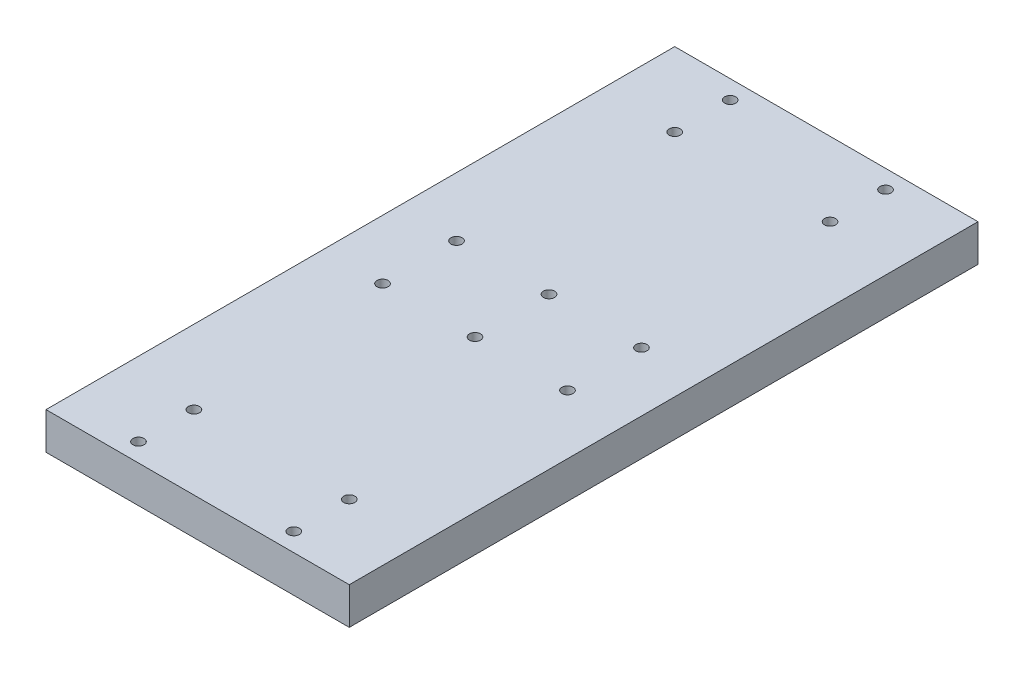
ISO-10303-21;
HEADER;
FILE_DESCRIPTION(('STEP AP214'),'2;1');
FILE_NAME('part.step','',(''),(''),'','','');
FILE_SCHEMA(('AUTOMOTIVE_DESIGN { 1 0 10303 214 1 1 1 1 }'));
ENDSEC;
DATA;
#1=APPLICATION_CONTEXT('core data for automotive mechanical design processes');
#2=APPLICATION_PROTOCOL_DEFINITION('international standard','automotive_design',2000,#1);
#3=PRODUCT_CONTEXT('',#1,'mechanical');
#4=PRODUCT('Part','Part','',(#3));
#5=PRODUCT_RELATED_PRODUCT_CATEGORY('part','',(#4));
#6=PRODUCT_DEFINITION_FORMATION('','',#4);
#7=PRODUCT_DEFINITION_CONTEXT('part definition',#1,'design');
#8=PRODUCT_DEFINITION('design','',#6,#7);
#9=PRODUCT_DEFINITION_SHAPE('','',#8);
#10=(LENGTH_UNIT() NAMED_UNIT(*) SI_UNIT(.MILLI.,.METRE.));
#11=(NAMED_UNIT(*) PLANE_ANGLE_UNIT() SI_UNIT($,.RADIAN.));
#12=(NAMED_UNIT(*) SI_UNIT($,.STERADIAN.) SOLID_ANGLE_UNIT());
#13=UNCERTAINTY_MEASURE_WITH_UNIT(LENGTH_MEASURE(1.E-05),#10,'distance_accuracy_value','');
#14=(GEOMETRIC_REPRESENTATION_CONTEXT(3) GLOBAL_UNCERTAINTY_ASSIGNED_CONTEXT((#13)) GLOBAL_UNIT_ASSIGNED_CONTEXT((#10,
#11,#12)) REPRESENTATION_CONTEXT('',''));
#15=CARTESIAN_POINT('',(0.,0.,0.));
#16=DIRECTION('',(0.,0.,1.));
#17=DIRECTION('',(1.,0.,0.));
#18=AXIS2_PLACEMENT_3D('',#15,#16,#17);
#19=CARTESIAN_POINT('',(41.,10.,-85.));
#20=DIRECTION('',(-1.,0.,0.));
#21=DIRECTION('',(0.,0.,1.));
#22=AXIS2_PLACEMENT_3D('',#19,#20,#21);
#23=PLANE('',#22);
#24=DIRECTION('',(0.,0.,-1.));
#25=VECTOR('',#24,1.);
#26=CARTESIAN_POINT('',(41.,0.,-85.));
#27=LINE('',#26,#25);
#28=CARTESIAN_POINT('',(41.,0.,85.));
#29=VERTEX_POINT('',#28);
#30=CARTESIAN_POINT('',(41.,0.,-85.));
#31=VERTEX_POINT('',#30);
#32=EDGE_CURVE('E102',#29,#31,#27,.T.);
#33=ORIENTED_EDGE('',*,*,#32,.T.);
#34=DIRECTION('',(0.,-1.,0.));
#35=VECTOR('',#34,1.);
#36=CARTESIAN_POINT('',(41.,10.,-85.));
#37=LINE('',#36,#35);
#38=CARTESIAN_POINT('',(41.,10.,-85.));
#39=VERTEX_POINT('',#38);
#40=EDGE_CURVE('E11',#39,#31,#37,.T.);
#41=ORIENTED_EDGE('',*,*,#40,.F.);
#42=DIRECTION('',(0.,0.,-1.));
#43=VECTOR('',#42,1.);
#44=CARTESIAN_POINT('',(41.,10.,-85.));
#45=LINE('',#44,#43);
#46=CARTESIAN_POINT('',(41.,10.,85.));
#47=VERTEX_POINT('',#46);
#48=EDGE_CURVE('E90',#47,#39,#45,.T.);
#49=ORIENTED_EDGE('',*,*,#48,.F.);
#50=DIRECTION('',(0.,-1.,0.));
#51=VECTOR('',#50,1.);
#52=CARTESIAN_POINT('',(41.,10.,85.));
#53=LINE('',#52,#51);
#54=EDGE_CURVE('E98',#47,#29,#53,.T.);
#55=ORIENTED_EDGE('',*,*,#54,.T.);
#56=EDGE_LOOP('',(#33,#41,#49,#55));
#57=FACE_BOUND('',#56,.T.);
#58=ADVANCED_FACE('F39',(#57),#23,.F.);
#59=CARTESIAN_POINT('',(-41.,10.,-85.));
#60=DIRECTION('',(0.,0.,1.));
#61=DIRECTION('',(1.,0.,0.));
#62=AXIS2_PLACEMENT_3D('',#59,#60,#61);
#63=PLANE('',#62);
#64=DIRECTION('',(-1.,0.,0.));
#65=VECTOR('',#64,1.);
#66=CARTESIAN_POINT('',(-41.,0.,-85.));
#67=LINE('',#66,#65);
#68=CARTESIAN_POINT('',(-41.,0.,-85.));
#69=VERTEX_POINT('',#68);
#70=EDGE_CURVE('E94',#31,#69,#67,.T.);
#71=ORIENTED_EDGE('',*,*,#70,.T.);
#72=DIRECTION('',(0.,-1.,0.));
#73=VECTOR('',#72,1.);
#74=CARTESIAN_POINT('',(-41.,10.,-85.));
#75=LINE('',#74,#73);
#76=CARTESIAN_POINT('',(-41.,10.,-85.));
#77=VERTEX_POINT('',#76);
#78=EDGE_CURVE('E47',#77,#69,#75,.T.);
#79=ORIENTED_EDGE('',*,*,#78,.F.);
#80=DIRECTION('',(-1.,0.,0.));
#81=VECTOR('',#80,1.);
#82=CARTESIAN_POINT('',(-41.,10.,-85.));
#83=LINE('',#82,#81);
#84=EDGE_CURVE('E85',#39,#77,#83,.T.);
#85=ORIENTED_EDGE('',*,*,#84,.F.);
#86=ORIENTED_EDGE('',*,*,#40,.T.);
#87=EDGE_LOOP('',(#71,#79,#85,#86));
#88=FACE_BOUND('',#87,.T.);
#89=ADVANCED_FACE('F93',(#88),#63,.F.);
#90=CARTESIAN_POINT('',(-41.,10.,-85.));
#91=DIRECTION('',(1.,0.,0.));
#92=DIRECTION('',(0.,0.,-1.));
#93=AXIS2_PLACEMENT_3D('',#90,#91,#92);
#94=PLANE('',#93);
#95=DIRECTION('',(0.,0.,1.));
#96=VECTOR('',#95,1.);
#97=CARTESIAN_POINT('',(-41.,0.,-85.));
#98=LINE('',#97,#96);
#99=CARTESIAN_POINT('',(-41.,0.,85.));
#100=VERTEX_POINT('',#99);
#101=EDGE_CURVE('E72',#69,#100,#98,.T.);
#102=ORIENTED_EDGE('',*,*,#101,.T.);
#103=DIRECTION('',(0.,-1.,0.));
#104=VECTOR('',#103,1.);
#105=CARTESIAN_POINT('',(-41.,10.,85.));
#106=LINE('',#105,#104);
#107=CARTESIAN_POINT('',(-41.,10.,85.));
#108=VERTEX_POINT('',#107);
#109=EDGE_CURVE('E95',#108,#100,#106,.T.);
#110=ORIENTED_EDGE('',*,*,#109,.F.);
#111=DIRECTION('',(0.,0.,1.));
#112=VECTOR('',#111,1.);
#113=CARTESIAN_POINT('',(-41.,10.,-85.));
#114=LINE('',#113,#112);
#115=EDGE_CURVE('E88',#77,#108,#114,.T.);
#116=ORIENTED_EDGE('',*,*,#115,.F.);
#117=ORIENTED_EDGE('',*,*,#78,.T.);
#118=EDGE_LOOP('',(#102,#110,#116,#117));
#119=FACE_BOUND('',#118,.T.);
#120=ADVANCED_FACE('F96',(#119),#94,.F.);
#121=CARTESIAN_POINT('',(-41.,10.,85.));
#122=DIRECTION('',(0.,0.,-1.));
#123=DIRECTION('',(-1.,0.,0.));
#124=AXIS2_PLACEMENT_3D('',#121,#122,#123);
#125=PLANE('',#124);
#126=DIRECTION('',(1.,0.,0.));
#127=VECTOR('',#126,1.);
#128=CARTESIAN_POINT('',(-41.,0.,85.));
#129=LINE('',#128,#127);
#130=EDGE_CURVE('E78',#100,#29,#129,.T.);
#131=ORIENTED_EDGE('',*,*,#130,.T.);
#132=ORIENTED_EDGE('',*,*,#54,.F.);
#133=DIRECTION('',(1.,0.,0.));
#134=VECTOR('',#133,1.);
#135=CARTESIAN_POINT('',(-41.,10.,85.));
#136=LINE('',#135,#134);
#137=EDGE_CURVE('E55',#108,#47,#136,.T.);
#138=ORIENTED_EDGE('',*,*,#137,.F.);
#139=ORIENTED_EDGE('',*,*,#109,.T.);
#140=EDGE_LOOP('',(#131,#132,#138,#139));
#141=FACE_BOUND('',#140,.T.);
#142=ADVANCED_FACE('F110',(#141),#125,.F.);
#143=CARTESIAN_POINT('',(0.,10.,0.));
#144=DIRECTION('',(0.,1.,0.));
#145=DIRECTION('',(0.,0.,1.));
#146=AXIS2_PLACEMENT_3D('',#143,#144,#145);
#147=PLANE('',#146);
#148=CARTESIAN_POINT('',(21.,10.,80.));
#149=DIRECTION('',(0.,1.,0.));
#150=DIRECTION('',(0.,0.,-1.));
#151=AXIS2_PLACEMENT_3D('',#148,#149,#150);
#152=CIRCLE('',#151,1.5);
#153=CARTESIAN_POINT('',(21.,10.,78.5));
#154=VERTEX_POINT('',#153);
#155=EDGE_CURVE('E180',#154,#154,#152,.T.);
#156=ORIENTED_EDGE('',*,*,#155,.F.);
#157=EDGE_LOOP('',(#156));
#158=FACE_BOUND('',#157,.T.);
#159=CARTESIAN_POINT('',(21.,10.,65.));
#160=DIRECTION('',(0.,1.,0.));
#161=DIRECTION('',(0.,0.,-1.));
#162=AXIS2_PLACEMENT_3D('',#159,#160,#161);
#163=CIRCLE('',#162,1.5);
#164=CARTESIAN_POINT('',(21.,10.,63.5));
#165=VERTEX_POINT('',#164);
#166=EDGE_CURVE('E191',#165,#165,#163,.T.);
#167=ORIENTED_EDGE('',*,*,#166,.F.);
#168=EDGE_LOOP('',(#167));
#169=FACE_BOUND('',#168,.T.);
#170=CARTESIAN_POINT('',(21.,10.,-80.));
#171=DIRECTION('',(0.,-1.,0.));
#172=DIRECTION('',(0.,0.,1.));
#173=AXIS2_PLACEMENT_3D('',#170,#171,#172);
#174=CIRCLE('',#173,1.5);
#175=CARTESIAN_POINT('',(21.,10.,-78.5));
#176=VERTEX_POINT('',#175);
#177=EDGE_CURVE('E168',#176,#176,#174,.T.);
#178=ORIENTED_EDGE('',*,*,#177,.T.);
#179=EDGE_LOOP('',(#178));
#180=FACE_BOUND('',#179,.T.);
#181=CARTESIAN_POINT('',(21.,10.,-65.));
#182=DIRECTION('',(0.,-1.,0.));
#183=DIRECTION('',(0.,0.,1.));
#184=AXIS2_PLACEMENT_3D('',#181,#182,#183);
#185=CIRCLE('',#184,1.5);
#186=CARTESIAN_POINT('',(21.,10.,-63.5));
#187=VERTEX_POINT('',#186);
#188=EDGE_CURVE('E179',#187,#187,#185,.T.);
#189=ORIENTED_EDGE('',*,*,#188,.T.);
#190=EDGE_LOOP('',(#189));
#191=FACE_BOUND('',#190,.T.);
#192=CARTESIAN_POINT('',(-21.,10.,-80.));
#193=DIRECTION('',(0.,1.,0.));
#194=DIRECTION('',(0.,0.,1.));
#195=AXIS2_PLACEMENT_3D('',#192,#193,#194);
#196=CIRCLE('',#195,1.5);
#197=CARTESIAN_POINT('',(-21.,10.,-78.5));
#198=VERTEX_POINT('',#197);
#199=EDGE_CURVE('E156',#198,#198,#196,.T.);
#200=ORIENTED_EDGE('',*,*,#199,.F.);
#201=EDGE_LOOP('',(#200));
#202=FACE_BOUND('',#201,.T.);
#203=CARTESIAN_POINT('',(-21.,10.,-65.));
#204=DIRECTION('',(0.,1.,0.));
#205=DIRECTION('',(0.,0.,1.));
#206=AXIS2_PLACEMENT_3D('',#203,#204,#205);
#207=CIRCLE('',#206,1.5);
#208=CARTESIAN_POINT('',(-21.,10.,-63.5));
#209=VERTEX_POINT('',#208);
#210=EDGE_CURVE('E167',#209,#209,#207,.T.);
#211=ORIENTED_EDGE('',*,*,#210,.F.);
#212=EDGE_LOOP('',(#211));
#213=FACE_BOUND('',#212,.T.);
#214=CARTESIAN_POINT('',(-21.,10.,80.));
#215=DIRECTION('',(0.,-1.,0.));
#216=DIRECTION('',(0.,0.,-1.));
#217=AXIS2_PLACEMENT_3D('',#214,#215,#216);
#218=CIRCLE('',#217,1.5);
#219=CARTESIAN_POINT('',(-21.,10.,78.5));
#220=VERTEX_POINT('',#219);
#221=EDGE_CURVE('E149',#220,#220,#218,.T.);
#222=ORIENTED_EDGE('',*,*,#221,.T.);
#223=EDGE_LOOP('',(#222));
#224=FACE_BOUND('',#223,.T.);
#225=CARTESIAN_POINT('',(-21.,10.,65.));
#226=DIRECTION('',(0.,-1.,0.));
#227=DIRECTION('',(0.,0.,-1.));
#228=AXIS2_PLACEMENT_3D('',#225,#226,#227);
#229=CIRCLE('',#228,1.5);
#230=CARTESIAN_POINT('',(-21.,10.,63.5));
#231=VERTEX_POINT('',#230);
#232=EDGE_CURVE('E155',#231,#231,#229,.T.);
#233=ORIENTED_EDGE('',*,*,#232,.T.);
#234=EDGE_LOOP('',(#233));
#235=FACE_BOUND('',#234,.T.);
#236=CARTESIAN_POINT('',(0.,10.,-10.));
#237=DIRECTION('',(0.,1.,0.));
#238=DIRECTION('',(0.,0.,1.));
#239=AXIS2_PLACEMENT_3D('',#236,#237,#238);
#240=CIRCLE('',#239,1.5);
#241=CARTESIAN_POINT('',(0.,10.,-8.50000000000001));
#242=VERTEX_POINT('',#241);
#243=EDGE_CURVE('E141',#242,#242,#240,.T.);
#244=ORIENTED_EDGE('',*,*,#243,.F.);
#245=EDGE_LOOP('',(#244));
#246=FACE_BOUND('',#245,.T.);
#247=CARTESIAN_POINT('',(25.,10.,-10.));
#248=DIRECTION('',(0.,1.,0.));
#249=DIRECTION('',(0.,0.,1.));
#250=AXIS2_PLACEMENT_3D('',#247,#248,#249);
#251=CIRCLE('',#250,1.5);
#252=CARTESIAN_POINT('',(25.,10.,-8.50000000000001));
#253=VERTEX_POINT('',#252);
#254=EDGE_CURVE('E135',#253,#253,#251,.T.);
#255=ORIENTED_EDGE('',*,*,#254,.F.);
#256=EDGE_LOOP('',(#255));
#257=FACE_BOUND('',#256,.T.);
#258=CARTESIAN_POINT('',(-25.,10.,9.99999999999999));
#259=DIRECTION('',(0.,1.,0.));
#260=DIRECTION('',(0.,0.,1.));
#261=AXIS2_PLACEMENT_3D('',#258,#259,#260);
#262=CIRCLE('',#261,1.5);
#263=CARTESIAN_POINT('',(-25.,10.,11.5));
#264=VERTEX_POINT('',#263);
#265=EDGE_CURVE('E129',#264,#264,#262,.T.);
#266=ORIENTED_EDGE('',*,*,#265,.F.);
#267=EDGE_LOOP('',(#266));
#268=FACE_BOUND('',#267,.T.);
#269=CARTESIAN_POINT('',(0.,10.,9.99999999999999));
#270=DIRECTION('',(0.,1.,0.));
#271=DIRECTION('',(0.,0.,1.));
#272=AXIS2_PLACEMENT_3D('',#269,#270,#271);
#273=CIRCLE('',#272,1.5);
#274=CARTESIAN_POINT('',(0.,10.,11.5));
#275=VERTEX_POINT('',#274);
#276=EDGE_CURVE('E122',#275,#275,#273,.T.);
#277=ORIENTED_EDGE('',*,*,#276,.F.);
#278=EDGE_LOOP('',(#277));
#279=FACE_BOUND('',#278,.T.);
#280=CARTESIAN_POINT('',(25.,10.,9.99999999999999));
#281=DIRECTION('',(0.,1.,0.));
#282=DIRECTION('',(0.,0.,1.));
#283=AXIS2_PLACEMENT_3D('',#280,#281,#282);
#284=CIRCLE('',#283,1.5);
#285=CARTESIAN_POINT('',(25.,10.,11.5));
#286=VERTEX_POINT('',#285);
#287=EDGE_CURVE('E146',#286,#286,#284,.T.);
#288=ORIENTED_EDGE('',*,*,#287,.F.);
#289=EDGE_LOOP('',(#288));
#290=FACE_BOUND('',#289,.T.);
#291=CARTESIAN_POINT('',(-25.,10.,-10.));
#292=DIRECTION('',(0.,1.,0.));
#293=DIRECTION('',(0.,0.,1.));
#294=AXIS2_PLACEMENT_3D('',#291,#292,#293);
#295=CIRCLE('',#294,1.5);
#296=CARTESIAN_POINT('',(-25.,10.,-8.50000000000001));
#297=VERTEX_POINT('',#296);
#298=EDGE_CURVE('E116',#297,#297,#295,.T.);
#299=ORIENTED_EDGE('',*,*,#298,.F.);
#300=EDGE_LOOP('',(#299));
#301=FACE_BOUND('',#300,.T.);
#302=ORIENTED_EDGE('',*,*,#48,.T.);
#303=ORIENTED_EDGE('',*,*,#84,.T.);
#304=ORIENTED_EDGE('',*,*,#115,.T.);
#305=ORIENTED_EDGE('',*,*,#137,.T.);
#306=EDGE_LOOP('',(#302,#303,#304,#305));
#307=FACE_BOUND('',#306,.T.);
#308=ADVANCED_FACE('F86',(#158,#169,#180,#191,#202,#213,#224,#235,#246,#257,#268,#279,#290,#301,
#307),#147,.T.);
#309=CARTESIAN_POINT('',(0.,0.,0.));
#310=DIRECTION('',(0.,1.,0.));
#311=DIRECTION('',(0.,0.,1.));
#312=AXIS2_PLACEMENT_3D('',#309,#310,#311);
#313=PLANE('',#312);
#314=CARTESIAN_POINT('',(21.,0.,80.));
#315=DIRECTION('',(0.,1.,0.));
#316=DIRECTION('',(0.,0.,-1.));
#317=AXIS2_PLACEMENT_3D('',#314,#315,#316);
#318=CIRCLE('',#317,1.5);
#319=CARTESIAN_POINT('',(21.,0.,78.5));
#320=VERTEX_POINT('',#319);
#321=EDGE_CURVE('E194',#320,#320,#318,.T.);
#322=ORIENTED_EDGE('',*,*,#321,.T.);
#323=EDGE_LOOP('',(#322));
#324=FACE_BOUND('',#323,.T.);
#325=CARTESIAN_POINT('',(21.,0.,65.));
#326=DIRECTION('',(0.,1.,0.));
#327=DIRECTION('',(0.,0.,-1.));
#328=AXIS2_PLACEMENT_3D('',#325,#326,#327);
#329=CIRCLE('',#328,1.5);
#330=CARTESIAN_POINT('',(21.,0.,63.5));
#331=VERTEX_POINT('',#330);
#332=EDGE_CURVE('E188',#331,#331,#329,.T.);
#333=ORIENTED_EDGE('',*,*,#332,.T.);
#334=EDGE_LOOP('',(#333));
#335=FACE_BOUND('',#334,.T.);
#336=CARTESIAN_POINT('',(21.,0.,-80.));
#337=DIRECTION('',(0.,-1.,0.));
#338=DIRECTION('',(0.,0.,1.));
#339=AXIS2_PLACEMENT_3D('',#336,#337,#338);
#340=CIRCLE('',#339,1.5);
#341=CARTESIAN_POINT('',(21.,0.,-78.5));
#342=VERTEX_POINT('',#341);
#343=EDGE_CURVE('E183',#342,#342,#340,.T.);
#344=ORIENTED_EDGE('',*,*,#343,.F.);
#345=EDGE_LOOP('',(#344));
#346=FACE_BOUND('',#345,.T.);
#347=CARTESIAN_POINT('',(21.,0.,-65.));
#348=DIRECTION('',(0.,-1.,0.));
#349=DIRECTION('',(0.,0.,1.));
#350=AXIS2_PLACEMENT_3D('',#347,#348,#349);
#351=CIRCLE('',#350,1.5);
#352=CARTESIAN_POINT('',(21.,0.,-63.5));
#353=VERTEX_POINT('',#352);
#354=EDGE_CURVE('E176',#353,#353,#351,.T.);
#355=ORIENTED_EDGE('',*,*,#354,.F.);
#356=EDGE_LOOP('',(#355));
#357=FACE_BOUND('',#356,.T.);
#358=CARTESIAN_POINT('',(-21.,0.,-80.));
#359=DIRECTION('',(0.,1.,0.));
#360=DIRECTION('',(0.,0.,1.));
#361=AXIS2_PLACEMENT_3D('',#358,#359,#360);
#362=CIRCLE('',#361,1.5);
#363=CARTESIAN_POINT('',(-21.,0.,-78.5));
#364=VERTEX_POINT('',#363);
#365=EDGE_CURVE('E171',#364,#364,#362,.T.);
#366=ORIENTED_EDGE('',*,*,#365,.T.);
#367=EDGE_LOOP('',(#366));
#368=FACE_BOUND('',#367,.T.);
#369=CARTESIAN_POINT('',(-21.,0.,-65.));
#370=DIRECTION('',(0.,1.,0.));
#371=DIRECTION('',(0.,0.,1.));
#372=AXIS2_PLACEMENT_3D('',#369,#370,#371);
#373=CIRCLE('',#372,1.5);
#374=CARTESIAN_POINT('',(-21.,0.,-63.5));
#375=VERTEX_POINT('',#374);
#376=EDGE_CURVE('E164',#375,#375,#373,.T.);
#377=ORIENTED_EDGE('',*,*,#376,.T.);
#378=EDGE_LOOP('',(#377));
#379=FACE_BOUND('',#378,.T.);
#380=CARTESIAN_POINT('',(-21.,0.,80.));
#381=DIRECTION('',(0.,-1.,0.));
#382=DIRECTION('',(0.,0.,-1.));
#383=AXIS2_PLACEMENT_3D('',#380,#381,#382);
#384=CIRCLE('',#383,1.5);
#385=CARTESIAN_POINT('',(-21.,0.,78.5));
#386=VERTEX_POINT('',#385);
#387=EDGE_CURVE('E159',#386,#386,#384,.T.);
#388=ORIENTED_EDGE('',*,*,#387,.F.);
#389=EDGE_LOOP('',(#388));
#390=FACE_BOUND('',#389,.T.);
#391=CARTESIAN_POINT('',(-21.,0.,65.));
#392=DIRECTION('',(0.,-1.,0.));
#393=DIRECTION('',(0.,0.,-1.));
#394=AXIS2_PLACEMENT_3D('',#391,#392,#393);
#395=CIRCLE('',#394,1.5);
#396=CARTESIAN_POINT('',(-21.,0.,63.5));
#397=VERTEX_POINT('',#396);
#398=EDGE_CURVE('E152',#397,#397,#395,.T.);
#399=ORIENTED_EDGE('',*,*,#398,.F.);
#400=EDGE_LOOP('',(#399));
#401=FACE_BOUND('',#400,.T.);
#402=CARTESIAN_POINT('',(0.,0.,-10.));
#403=DIRECTION('',(0.,1.,0.));
#404=DIRECTION('',(0.,0.,1.));
#405=AXIS2_PLACEMENT_3D('',#402,#403,#404);
#406=CIRCLE('',#405,1.5);
#407=CARTESIAN_POINT('',(0.,0.,-8.50000000000001));
#408=VERTEX_POINT('',#407);
#409=EDGE_CURVE('E119',#408,#408,#406,.T.);
#410=ORIENTED_EDGE('',*,*,#409,.T.);
#411=EDGE_LOOP('',(#410));
#412=FACE_BOUND('',#411,.T.);
#413=CARTESIAN_POINT('',(25.,0.,-10.));
#414=DIRECTION('',(0.,1.,0.));
#415=DIRECTION('',(0.,0.,1.));
#416=AXIS2_PLACEMENT_3D('',#413,#414,#415);
#417=CIRCLE('',#416,1.5);
#418=CARTESIAN_POINT('',(25.,0.,-8.50000000000001));
#419=VERTEX_POINT('',#418);
#420=EDGE_CURVE('E138',#419,#419,#417,.T.);
#421=ORIENTED_EDGE('',*,*,#420,.T.);
#422=EDGE_LOOP('',(#421));
#423=FACE_BOUND('',#422,.T.);
#424=CARTESIAN_POINT('',(-25.,0.,9.99999999999999));
#425=DIRECTION('',(0.,1.,0.));
#426=DIRECTION('',(0.,0.,1.));
#427=AXIS2_PLACEMENT_3D('',#424,#425,#426);
#428=CIRCLE('',#427,1.5);
#429=CARTESIAN_POINT('',(-25.,0.,11.5));
#430=VERTEX_POINT('',#429);
#431=EDGE_CURVE('E132',#430,#430,#428,.T.);
#432=ORIENTED_EDGE('',*,*,#431,.T.);
#433=EDGE_LOOP('',(#432));
#434=FACE_BOUND('',#433,.T.);
#435=CARTESIAN_POINT('',(0.,0.,9.99999999999999));
#436=DIRECTION('',(0.,1.,0.));
#437=DIRECTION('',(0.,0.,1.));
#438=AXIS2_PLACEMENT_3D('',#435,#436,#437);
#439=CIRCLE('',#438,1.5);
#440=CARTESIAN_POINT('',(0.,0.,11.5));
#441=VERTEX_POINT('',#440);
#442=EDGE_CURVE('E125',#441,#441,#439,.T.);
#443=ORIENTED_EDGE('',*,*,#442,.T.);
#444=EDGE_LOOP('',(#443));
#445=FACE_BOUND('',#444,.T.);
#446=CARTESIAN_POINT('',(25.,0.,9.99999999999999));
#447=DIRECTION('',(0.,1.,0.));
#448=DIRECTION('',(0.,0.,1.));
#449=AXIS2_PLACEMENT_3D('',#446,#447,#448);
#450=CIRCLE('',#449,1.5);
#451=CARTESIAN_POINT('',(25.,0.,11.5));
#452=VERTEX_POINT('',#451);
#453=EDGE_CURVE('E126',#452,#452,#450,.T.);
#454=ORIENTED_EDGE('',*,*,#453,.T.);
#455=EDGE_LOOP('',(#454));
#456=FACE_BOUND('',#455,.T.);
#457=CARTESIAN_POINT('',(-25.,0.,-10.));
#458=DIRECTION('',(0.,1.,0.));
#459=DIRECTION('',(0.,0.,1.));
#460=AXIS2_PLACEMENT_3D('',#457,#458,#459);
#461=CIRCLE('',#460,1.5);
#462=CARTESIAN_POINT('',(-25.,0.,-8.50000000000001));
#463=VERTEX_POINT('',#462);
#464=EDGE_CURVE('E105',#463,#463,#461,.T.);
#465=ORIENTED_EDGE('',*,*,#464,.T.);
#466=EDGE_LOOP('',(#465));
#467=FACE_BOUND('',#466,.T.);
#468=ORIENTED_EDGE('',*,*,#32,.F.);
#469=ORIENTED_EDGE('',*,*,#130,.F.);
#470=ORIENTED_EDGE('',*,*,#101,.F.);
#471=ORIENTED_EDGE('',*,*,#70,.F.);
#472=EDGE_LOOP('',(#468,#469,#470,#471));
#473=FACE_BOUND('',#472,.T.);
#474=ADVANCED_FACE('F113',(#324,#335,#346,#357,#368,#379,#390,#401,#412,#423,#434,#445,#456,
#467,#473),#313,.F.);
#475=CARTESIAN_POINT('',(-25.,0.,-10.));
#476=DIRECTION('',(0.,1.,0.));
#477=DIRECTION('',(0.,0.,1.));
#478=AXIS2_PLACEMENT_3D('',#475,#476,#477);
#479=CYLINDRICAL_SURFACE('',#478,1.5);
#480=ORIENTED_EDGE('',*,*,#464,.F.);
#481=EDGE_LOOP('',(#480));
#482=FACE_BOUND('',#481,.T.);
#483=ORIENTED_EDGE('',*,*,#298,.T.);
#484=EDGE_LOOP('',(#483));
#485=FACE_BOUND('',#484,.T.);
#486=ADVANCED_FACE('F232',(#482,#485),#479,.F.);
#487=CARTESIAN_POINT('',(25.,0.,9.99999999999999));
#488=DIRECTION('',(0.,1.,0.));
#489=DIRECTION('',(0.,0.,1.));
#490=AXIS2_PLACEMENT_3D('',#487,#488,#489);
#491=CYLINDRICAL_SURFACE('',#490,1.5);
#492=ORIENTED_EDGE('',*,*,#453,.F.);
#493=EDGE_LOOP('',(#492));
#494=FACE_BOUND('',#493,.T.);
#495=ORIENTED_EDGE('',*,*,#287,.T.);
#496=EDGE_LOOP('',(#495));
#497=FACE_BOUND('',#496,.T.);
#498=ADVANCED_FACE('F234',(#494,#497),#491,.F.);
#499=CARTESIAN_POINT('',(0.,0.,9.99999999999999));
#500=DIRECTION('',(0.,1.,0.));
#501=DIRECTION('',(0.,0.,1.));
#502=AXIS2_PLACEMENT_3D('',#499,#500,#501);
#503=CYLINDRICAL_SURFACE('',#502,1.5);
#504=ORIENTED_EDGE('',*,*,#442,.F.);
#505=EDGE_LOOP('',(#504));
#506=FACE_BOUND('',#505,.T.);
#507=ORIENTED_EDGE('',*,*,#276,.T.);
#508=EDGE_LOOP('',(#507));
#509=FACE_BOUND('',#508,.T.);
#510=ADVANCED_FACE('F241',(#506,#509),#503,.F.);
#511=CARTESIAN_POINT('',(-25.,0.,9.99999999999999));
#512=DIRECTION('',(0.,1.,0.));
#513=DIRECTION('',(0.,0.,1.));
#514=AXIS2_PLACEMENT_3D('',#511,#512,#513);
#515=CYLINDRICAL_SURFACE('',#514,1.5);
#516=ORIENTED_EDGE('',*,*,#431,.F.);
#517=EDGE_LOOP('',(#516));
#518=FACE_BOUND('',#517,.T.);
#519=ORIENTED_EDGE('',*,*,#265,.T.);
#520=EDGE_LOOP('',(#519));
#521=FACE_BOUND('',#520,.T.);
#522=ADVANCED_FACE('F341',(#518,#521),#515,.F.);
#523=CARTESIAN_POINT('',(25.,0.,-10.));
#524=DIRECTION('',(0.,1.,0.));
#525=DIRECTION('',(0.,0.,1.));
#526=AXIS2_PLACEMENT_3D('',#523,#524,#525);
#527=CYLINDRICAL_SURFACE('',#526,1.5);
#528=ORIENTED_EDGE('',*,*,#420,.F.);
#529=EDGE_LOOP('',(#528));
#530=FACE_BOUND('',#529,.T.);
#531=ORIENTED_EDGE('',*,*,#254,.T.);
#532=EDGE_LOOP('',(#531));
#533=FACE_BOUND('',#532,.T.);
#534=ADVANCED_FACE('F337',(#530,#533),#527,.F.);
#535=CARTESIAN_POINT('',(0.,0.,-10.));
#536=DIRECTION('',(0.,1.,0.));
#537=DIRECTION('',(0.,0.,1.));
#538=AXIS2_PLACEMENT_3D('',#535,#536,#537);
#539=CYLINDRICAL_SURFACE('',#538,1.5);
#540=ORIENTED_EDGE('',*,*,#409,.F.);
#541=EDGE_LOOP('',(#540));
#542=FACE_BOUND('',#541,.T.);
#543=ORIENTED_EDGE('',*,*,#243,.T.);
#544=EDGE_LOOP('',(#543));
#545=FACE_BOUND('',#544,.T.);
#546=ADVANCED_FACE('F332',(#542,#545),#539,.F.);
#547=CARTESIAN_POINT('',(-21.,10.,65.));
#548=DIRECTION('',(0.,-1.,0.));
#549=DIRECTION('',(0.,0.,-1.));
#550=AXIS2_PLACEMENT_3D('',#547,#548,#549);
#551=CYLINDRICAL_SURFACE('',#550,1.5);
#552=ORIENTED_EDGE('',*,*,#232,.F.);
#553=EDGE_LOOP('',(#552));
#554=FACE_BOUND('',#553,.T.);
#555=ORIENTED_EDGE('',*,*,#398,.T.);
#556=EDGE_LOOP('',(#555));
#557=FACE_BOUND('',#556,.T.);
#558=ADVANCED_FACE('F329',(#554,#557),#551,.F.);
#559=CARTESIAN_POINT('',(-21.,10.,80.));
#560=DIRECTION('',(0.,-1.,0.));
#561=DIRECTION('',(0.,0.,-1.));
#562=AXIS2_PLACEMENT_3D('',#559,#560,#561);
#563=CYLINDRICAL_SURFACE('',#562,1.5);
#564=ORIENTED_EDGE('',*,*,#221,.F.);
#565=EDGE_LOOP('',(#564));
#566=FACE_BOUND('',#565,.T.);
#567=ORIENTED_EDGE('',*,*,#387,.T.);
#568=EDGE_LOOP('',(#567));
#569=FACE_BOUND('',#568,.T.);
#570=ADVANCED_FACE('F325',(#566,#569),#563,.F.);
#571=CARTESIAN_POINT('',(-21.,10.,-65.));
#572=DIRECTION('',(0.,-1.,0.));
#573=DIRECTION('',(0.,0.,-1.));
#574=AXIS2_PLACEMENT_3D('',#571,#572,#573);
#575=CYLINDRICAL_SURFACE('',#574,1.5);
#576=ORIENTED_EDGE('',*,*,#210,.T.);
#577=EDGE_LOOP('',(#576));
#578=FACE_BOUND('',#577,.T.);
#579=ORIENTED_EDGE('',*,*,#376,.F.);
#580=EDGE_LOOP('',(#579));
#581=FACE_BOUND('',#580,.T.);
#582=ADVANCED_FACE('F321',(#578,#581),#575,.F.);
#583=CARTESIAN_POINT('',(-21.,10.,-80.));
#584=DIRECTION('',(0.,-1.,0.));
#585=DIRECTION('',(0.,0.,-1.));
#586=AXIS2_PLACEMENT_3D('',#583,#584,#585);
#587=CYLINDRICAL_SURFACE('',#586,1.5);
#588=ORIENTED_EDGE('',*,*,#199,.T.);
#589=EDGE_LOOP('',(#588));
#590=FACE_BOUND('',#589,.T.);
#591=ORIENTED_EDGE('',*,*,#365,.F.);
#592=EDGE_LOOP('',(#591));
#593=FACE_BOUND('',#592,.T.);
#594=ADVANCED_FACE('F285',(#590,#593),#587,.F.);
#595=CARTESIAN_POINT('',(21.,10.,-65.));
#596=DIRECTION('',(0.,-1.,0.));
#597=DIRECTION('',(0.,0.,-1.));
#598=AXIS2_PLACEMENT_3D('',#595,#596,#597);
#599=CYLINDRICAL_SURFACE('',#598,1.5);
#600=ORIENTED_EDGE('',*,*,#188,.F.);
#601=EDGE_LOOP('',(#600));
#602=FACE_BOUND('',#601,.T.);
#603=ORIENTED_EDGE('',*,*,#354,.T.);
#604=EDGE_LOOP('',(#603));
#605=FACE_BOUND('',#604,.T.);
#606=ADVANCED_FACE('F279',(#602,#605),#599,.F.);
#607=CARTESIAN_POINT('',(21.,10.,-80.));
#608=DIRECTION('',(0.,-1.,0.));
#609=DIRECTION('',(0.,0.,-1.));
#610=AXIS2_PLACEMENT_3D('',#607,#608,#609);
#611=CYLINDRICAL_SURFACE('',#610,1.5);
#612=ORIENTED_EDGE('',*,*,#177,.F.);
#613=EDGE_LOOP('',(#612));
#614=FACE_BOUND('',#613,.T.);
#615=ORIENTED_EDGE('',*,*,#343,.T.);
#616=EDGE_LOOP('',(#615));
#617=FACE_BOUND('',#616,.T.);
#618=ADVANCED_FACE('F284',(#614,#617),#611,.F.);
#619=CARTESIAN_POINT('',(21.,10.,65.));
#620=DIRECTION('',(0.,-1.,0.));
#621=DIRECTION('',(0.,0.,-1.));
#622=AXIS2_PLACEMENT_3D('',#619,#620,#621);
#623=CYLINDRICAL_SURFACE('',#622,1.5);
#624=ORIENTED_EDGE('',*,*,#166,.T.);
#625=EDGE_LOOP('',(#624));
#626=FACE_BOUND('',#625,.T.);
#627=ORIENTED_EDGE('',*,*,#332,.F.);
#628=EDGE_LOOP('',(#627));
#629=FACE_BOUND('',#628,.T.);
#630=ADVANCED_FACE('F297',(#626,#629),#623,.F.);
#631=CARTESIAN_POINT('',(21.,10.,80.));
#632=DIRECTION('',(0.,-1.,0.));
#633=DIRECTION('',(0.,0.,-1.));
#634=AXIS2_PLACEMENT_3D('',#631,#632,#633);
#635=CYLINDRICAL_SURFACE('',#634,1.5);
#636=ORIENTED_EDGE('',*,*,#155,.T.);
#637=EDGE_LOOP('',(#636));
#638=FACE_BOUND('',#637,.T.);
#639=ORIENTED_EDGE('',*,*,#321,.F.);
#640=EDGE_LOOP('',(#639));
#641=FACE_BOUND('',#640,.T.);
#642=ADVANCED_FACE('F200',(#638,#641),#635,.F.);
#643=CLOSED_SHELL('',(#58,#89,#120,#142,#308,#474,#486,#498,#510,#522,#534,#546,#558,#570,#582,
#594,#606,#618,#630,#642));
#644=MANIFOLD_SOLID_BREP('B2',#643);
#645=ADVANCED_BREP_SHAPE_REPRESENTATION('',(#18,#644),#14);
#646=SHAPE_DEFINITION_REPRESENTATION(#9,#645);
ENDSEC;
END-ISO-10303-21;
